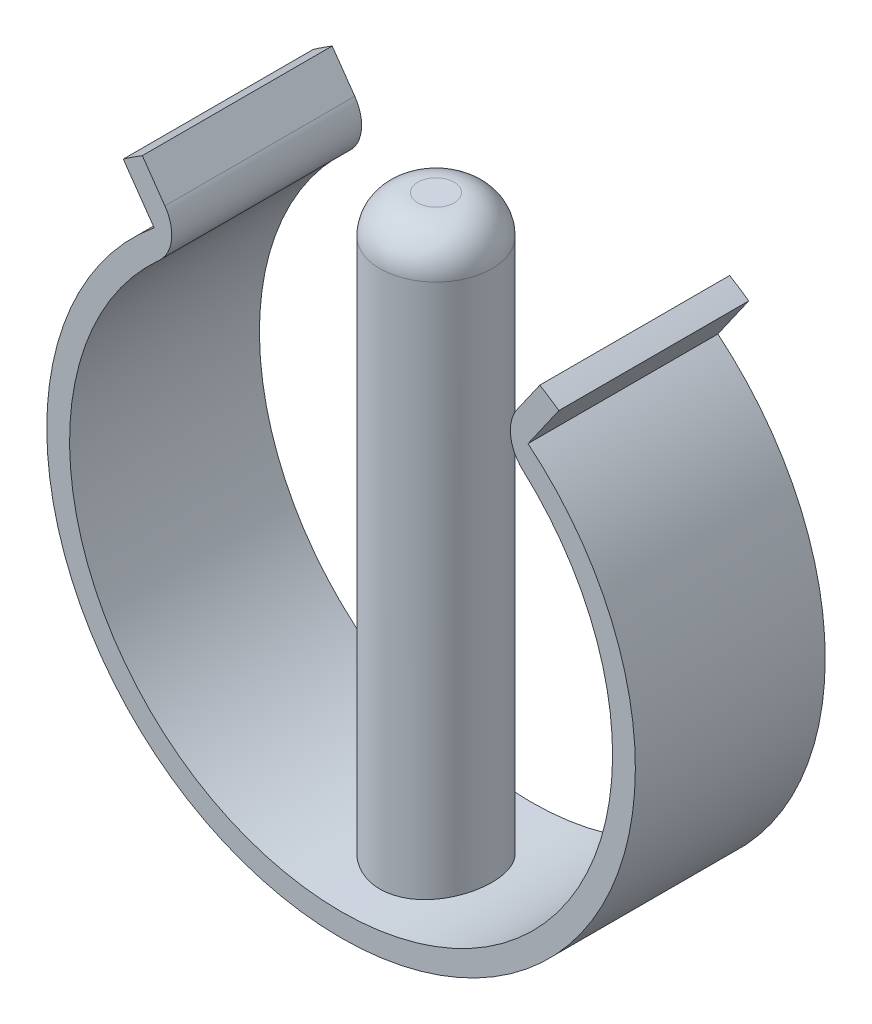
ISO-10303-21;
HEADER;
FILE_DESCRIPTION(('STEP AP214'),'2;1');
FILE_NAME('part.step','',(''),(''),'','','');
FILE_SCHEMA(('AUTOMOTIVE_DESIGN { 1 0 10303 214 1 1 1 1 }'));
ENDSEC;
DATA;
#1=APPLICATION_CONTEXT('core data for automotive mechanical design processes');
#2=APPLICATION_PROTOCOL_DEFINITION('international standard','automotive_design',2000,#1);
#3=PRODUCT_CONTEXT('',#1,'mechanical');
#4=PRODUCT('Part','Part','',(#3));
#5=PRODUCT_RELATED_PRODUCT_CATEGORY('part','',(#4));
#6=PRODUCT_DEFINITION_FORMATION('','',#4);
#7=PRODUCT_DEFINITION_CONTEXT('part definition',#1,'design');
#8=PRODUCT_DEFINITION('design','',#6,#7);
#9=PRODUCT_DEFINITION_SHAPE('','',#8);
#10=(LENGTH_UNIT() NAMED_UNIT(*) SI_UNIT(.MILLI.,.METRE.));
#11=(NAMED_UNIT(*) PLANE_ANGLE_UNIT() SI_UNIT($,.RADIAN.));
#12=(NAMED_UNIT(*) SI_UNIT($,.STERADIAN.) SOLID_ANGLE_UNIT());
#13=UNCERTAINTY_MEASURE_WITH_UNIT(LENGTH_MEASURE(1.E-05),#10,'distance_accuracy_value','');
#14=(GEOMETRIC_REPRESENTATION_CONTEXT(3) GLOBAL_UNCERTAINTY_ASSIGNED_CONTEXT((#13)) GLOBAL_UNIT_ASSIGNED_CONTEXT((#10,
#11,#12)) REPRESENTATION_CONTEXT('',''));
#15=CARTESIAN_POINT('',(0.,0.,0.));
#16=DIRECTION('',(0.,0.,1.));
#17=DIRECTION('',(1.,0.,0.));
#18=AXIS2_PLACEMENT_3D('',#15,#16,#17);
#19=CARTESIAN_POINT('',(0.,0.,-5.));
#20=DIRECTION('',(0.,0.,1.));
#21=DIRECTION('',(1.,0.,0.));
#22=AXIS2_PLACEMENT_3D('',#19,#20,#21);
#23=CYLINDRICAL_SURFACE('',#22,15.5);
#24=DIRECTION('',(0.,0.,1.));
#25=VECTOR('',#24,1.);
#26=CARTESIAN_POINT('',(9.84673362216088,11.9704568406643,-5.));
#27=LINE('',#26,#25);
#28=CARTESIAN_POINT('',(9.84673362216088,11.9704568406643,-5.));
#29=VERTEX_POINT('',#28);
#30=CARTESIAN_POINT('',(9.84673362216088,11.9704568406643,5.));
#31=VERTEX_POINT('',#30);
#32=EDGE_CURVE('E220',#29,#31,#27,.T.);
#33=ORIENTED_EDGE('',*,*,#32,.T.);
#34=CARTESIAN_POINT('',(0.,0.,5.));
#35=DIRECTION('',(0.,0.,1.));
#36=DIRECTION('',(1.,0.,0.));
#37=AXIS2_PLACEMENT_3D('',#34,#35,#36);
#38=CIRCLE('',#37,15.5);
#39=CARTESIAN_POINT('',(-9.84673362216089,11.9704568406643,5.));
#40=VERTEX_POINT('',#39);
#41=EDGE_CURVE('E298',#40,#31,#38,.T.);
#42=ORIENTED_EDGE('',*,*,#41,.F.);
#43=DIRECTION('',(0.,0.,1.));
#44=VECTOR('',#43,1.);
#45=CARTESIAN_POINT('',(-9.84673362216089,11.9704568406643,-5.));
#46=LINE('',#45,#44);
#47=CARTESIAN_POINT('',(-9.84673362216089,11.9704568406643,-5.));
#48=VERTEX_POINT('',#47);
#49=EDGE_CURVE('E216',#48,#40,#46,.T.);
#50=ORIENTED_EDGE('',*,*,#49,.F.);
#51=CARTESIAN_POINT('',(0.,0.,-5.));
#52=DIRECTION('',(0.,0.,1.));
#53=DIRECTION('',(1.,0.,0.));
#54=AXIS2_PLACEMENT_3D('',#51,#52,#53);
#55=CIRCLE('',#54,15.5);
#56=EDGE_CURVE('E296',#48,#29,#55,.T.);
#57=ORIENTED_EDGE('',*,*,#56,.T.);
#58=EDGE_LOOP('',(#33,#42,#50,#57));
#59=FACE_BOUND('',#58,.T.);
#60=CARTESIAN_POINT('',(-4.77223675564578,-14.7470592440684,1.65527062637535));
#61=CARTESIAN_POINT('',(-4.71636246479509,-14.7651434306736,1.73901117131563));
#62=CARTESIAN_POINT('',(-4.65690198422464,-14.7840314983771,1.82008646527447));
#63=CARTESIAN_POINT('',(-4.5316711499994,-14.8228954583229,1.97675558795974));
#64=CARTESIAN_POINT('',(-4.46590938134432,-14.8428698549168,2.05235663498693));
#65=CARTESIAN_POINT('',(-4.26119187841593,-14.9034346724191,2.27001731757343));
#66=CARTESIAN_POINT('',(-4.11399159584715,-14.9449363318782,2.4041187047719));
#67=CARTESIAN_POINT('',(-3.73592738668649,-15.0447856868346,2.70452618656024));
#68=CARTESIAN_POINT('',(-3.49631062950652,-15.1027012367679,2.85987488438209));
#69=CARTESIAN_POINT('',(-2.99312925519062,-15.210450570554,3.1313489943489));
#70=CARTESIAN_POINT('',(-2.72946179184354,-15.2602468400873,3.24729488063657));
#71=CARTESIAN_POINT('',(-2.28611144939952,-15.3314813210058,3.40672047791046));
#72=CARTESIAN_POINT('',(-2.1108443042756,-15.356640305997,3.46120982339265));
#73=CARTESIAN_POINT('',(-1.75574800628402,-15.401276786686,3.55602285113561));
#74=CARTESIAN_POINT('',(-1.5759177317838,-15.420752870511,3.59634301368035));
#75=CARTESIAN_POINT('',(-1.21332371881316,-15.4535103938055,3.66331540350875));
#76=CARTESIAN_POINT('',(-1.03056200056071,-15.4667959245349,3.6899766589571));
#77=CARTESIAN_POINT('',(-0.663159389704062,-15.4869002660163,3.73006952966727));
#78=CARTESIAN_POINT('',(-0.47851765447453,-15.4937160352894,3.74349492277431));
#79=CARTESIAN_POINT('',(-0.106921217796247,-15.5007554759639,3.75735880991027));
#80=CARTESIAN_POINT('',(0.0800391273800348,-15.5009178768654,3.75767659690342));
#81=CARTESIAN_POINT('',(0.453315892231561,-15.494493596953,3.74502807086891));
#82=CARTESIAN_POINT('',(0.639632554925448,-15.4879098279929,3.73206748919287));
#83=CARTESIAN_POINT('',(1.01063030618153,-15.4681337258967,3.69265817209845));
#84=CARTESIAN_POINT('',(1.19531003969522,-15.4549363589415,3.66619916232183));
#85=CARTESIAN_POINT('',(1.56155925139163,-15.4222343618315,3.59940099964486));
#86=CARTESIAN_POINT('',(1.74312938701404,-15.4027310826657,3.55906481969385));
#87=CARTESIAN_POINT('',(2.07283835609482,-15.3615213800739,3.47161447632755));
#88=CARTESIAN_POINT('',(2.22165354270744,-15.3406750741924,3.42663681205228));
#89=CARTESIAN_POINT('',(2.51508353930932,-15.2953057624268,3.32610914658735));
#90=CARTESIAN_POINT('',(2.65969921382182,-15.270783519779,3.2705613394372));
#91=CARTESIAN_POINT('',(2.94311217322447,-15.2186983518577,3.14863651328495));
#92=CARTESIAN_POINT('',(3.08192828067329,-15.1911465232026,3.08229861412333));
#93=CARTESIAN_POINT('',(3.35289491564658,-15.133646146656,2.93817752998317));
#94=CARTESIAN_POINT('',(3.48505038453811,-15.1036994194543,2.86040300252009));
#95=CARTESIAN_POINT('',(3.67249632208284,-15.0587686635973,2.73780743282703));
#96=CARTESIAN_POINT('',(3.73101929196821,-15.0443680451123,2.69766716734873));
#97=CARTESIAN_POINT('',(3.84618625318938,-15.0153384762655,2.61471658723914));
#98=CARTESIAN_POINT('',(3.90282786440912,-15.0007092687099,2.5719030740573));
#99=CARTESIAN_POINT('',(4.1239182767908,-14.9423052649877,2.39624598709964));
#100=CARTESIAN_POINT('',(4.28009367270594,-14.8980939651839,2.25276642564827));
#101=CARTESIAN_POINT('',(4.56696827236643,-14.812669991642,1.94150225240908));
#102=CARTESIAN_POINT('',(4.69771076460898,-14.7714522988834,1.77375980164158));
#103=CARTESIAN_POINT('',(4.86756006267002,-14.7159898051548,1.50700318945384));
#104=CARTESIAN_POINT('',(4.91937483563712,-14.6987168135106,1.41661672042463));
#105=CARTESIAN_POINT('',(5.01407942186206,-14.6666792592423,1.23073439204272));
#106=CARTESIAN_POINT('',(5.0569583985842,-14.6519177462503,1.13523250348432));
#107=CARTESIAN_POINT('',(5.09484763232555,-14.6387338114806,1.03744697777149));
#108=B_SPLINE_CURVE_WITH_KNOTS('',3,(#60,#61,#62,#63,#64,#65,#66,#67,#68,#69,#70,#71,#72,#73,
#74,#75,#76,#77,#78,#79,#80,#81,#82,#83,#84,#85,#86,#87,#88,#89,#90,#91,#92,#93,#94,#95,#96,#97,
#98,#99,#100,#101,#102,#103,#104,#105,#106,#107),.UNSPECIFIED.,.F.,.F.,(4,2,2,2,2,2,2,2,2,2,2,2,
2,2,2,2,2,2,2,2,2,2,2,4),(0.,0.306613586179854,0.612815219968257,1.22088489459189,
2.09049821300265,2.96402212092531,3.51916924688574,4.07445417763987,4.62937160514357,
5.18454977410793,5.7448394097782,6.30488730908343,6.86536212749915,7.42571694834263,
7.89586344055284,8.36591245092,8.83429378837111,9.3023223697217,9.51949195534505,
9.73692655839493,10.3842721224779,11.0305060308529,11.3468496170348,11.6635746322412),.UNSPECIFIED.);
#109=CARTESIAN_POINT('',(-3.95766012474572,-14.9862245524681,2.52833853146323));
#110=VERTEX_POINT('',#109);
#111=CARTESIAN_POINT('',(3.95766012474572,-14.9862245524681,2.52833853146323));
#112=VERTEX_POINT('',#111);
#113=EDGE_CURVE('E168',#110,#112,#108,.T.);
#114=ORIENTED_EDGE('',*,*,#113,.T.);
#115=DIRECTION('',(0.,0.,1.));
#116=VECTOR('',#115,1.);
#117=CARTESIAN_POINT('',(3.95766012474572,-14.9862245524681,-5.));
#118=LINE('',#117,#116);
#119=CARTESIAN_POINT('',(3.95766012474572,-14.9862245524681,-2.52833853146323));
#120=VERTEX_POINT('',#119);
#121=EDGE_CURVE('E11',#112,#120,#118,.F.);
#122=ORIENTED_EDGE('',*,*,#121,.T.);
#123=CARTESIAN_POINT('',(4.77223675564578,-14.7470592440684,-1.65527062637535));
#124=CARTESIAN_POINT('',(4.71636246479504,-14.7651434306736,-1.7390111713157));
#125=CARTESIAN_POINT('',(4.65690198422454,-14.7840314983772,-1.82008646527462));
#126=CARTESIAN_POINT('',(4.53167114999917,-14.822895458323,-1.97675558796002));
#127=CARTESIAN_POINT('',(4.46590938134402,-14.8428698549169,-2.05235663498726));
#128=CARTESIAN_POINT('',(4.26119187841543,-14.9034346724192,-2.27001731757392));
#129=CARTESIAN_POINT('',(4.11399159584649,-14.9449363318784,-2.40411870477248));
#130=CARTESIAN_POINT('',(3.73592738668559,-15.0447856868348,-2.70452618656087));
#131=CARTESIAN_POINT('',(3.49631062950554,-15.1027012367681,-2.85987488438269));
#132=CARTESIAN_POINT('',(2.99312925518948,-15.2104505705543,-3.13134899434944));
#133=CARTESIAN_POINT('',(2.72946179184233,-15.2602468400875,-3.24729488063708));
#134=CARTESIAN_POINT('',(2.2861114493982,-15.331481321006,-3.40672047791089));
#135=CARTESIAN_POINT('',(2.11084430427425,-15.3566403059972,-3.46120982339305));
#136=CARTESIAN_POINT('',(1.7557480062826,-15.4012767866862,-3.55602285113595));
#137=CARTESIAN_POINT('',(1.57591773178235,-15.4207528705111,-3.59634301368066));
#138=CARTESIAN_POINT('',(1.21332371881166,-15.4535103938057,-3.66331540350899));
#139=CARTESIAN_POINT('',(1.03056200055918,-15.466795924535,-3.6899766589573));
#140=CARTESIAN_POINT('',(0.663159389702477,-15.4869002660164,-3.73006952966741));
#141=CARTESIAN_POINT('',(0.478517654472921,-15.4937160352895,-3.74349492277441));
#142=CARTESIAN_POINT('',(0.106921217794594,-15.5007554759639,-3.75735880991029));
#143=CARTESIAN_POINT('',(-0.0800391273817059,-15.5009178768654,-3.7576765969034));
#144=CARTESIAN_POINT('',(-0.453315892233266,-15.4944935969529,-3.74502807086881));
#145=CARTESIAN_POINT('',(-0.639632554927168,-15.4879098279929,-3.73206748919273));
#146=CARTESIAN_POINT('',(-1.01063030618327,-15.4681337258966,-3.69265817209823));
#147=CARTESIAN_POINT('',(-1.19531003969698,-15.4549363589414,-3.66619916232156));
#148=CARTESIAN_POINT('',(-1.5615592513934,-15.4222343618313,-3.59940099964449));
#149=CARTESIAN_POINT('',(-1.74312938701582,-15.4027310826655,-3.55906481969344));
#150=CARTESIAN_POINT('',(-2.07283835609658,-15.3615213800737,-3.47161447632704));
#151=CARTESIAN_POINT('',(-2.22165354270918,-15.3406750741921,-3.42663681205173));
#152=CARTESIAN_POINT('',(-2.51508353931103,-15.2953057624265,-3.32610914658672));
#153=CARTESIAN_POINT('',(-2.65969921382351,-15.2707835197787,-3.27056133943653));
#154=CARTESIAN_POINT('',(-2.94311217322611,-15.2186983518574,-3.14863651328419));
#155=CARTESIAN_POINT('',(-3.08192828067491,-15.1911465232023,-3.08229861412253));
#156=CARTESIAN_POINT('',(-3.35289491564813,-15.1336461466556,-2.93817752998229));
#157=CARTESIAN_POINT('',(-3.48505038453963,-15.1036994194539,-2.86040300251916));
#158=CARTESIAN_POINT('',(-3.67249632208392,-15.058768663597,-2.7378074328263));
#159=CARTESIAN_POINT('',(-3.7310192919689,-15.0443680451122,-2.69766716734825));
#160=CARTESIAN_POINT('',(-3.8461862531893,-15.0153384762655,-2.6147165872392));
#161=CARTESIAN_POINT('',(-3.90282786440866,-15.00070926871,-2.57190307405765));
#162=CARTESIAN_POINT('',(-4.12391827678999,-14.942305264988,-2.39624598710035));
#163=CARTESIAN_POINT('',(-4.28009367270515,-14.8980939651841,-2.25276642564903));
#164=CARTESIAN_POINT('',(-4.5669682723657,-14.8126699916422,-1.94150225240995));
#165=CARTESIAN_POINT('',(-4.69771076460829,-14.7714522988836,-1.77375980164251));
#166=CARTESIAN_POINT('',(-4.86756006266953,-14.715989805155,-1.50700318945469));
#167=CARTESIAN_POINT('',(-4.91937483563675,-14.6987168135107,-1.41661672042533));
#168=CARTESIAN_POINT('',(-5.0140794218619,-14.6666792592423,-1.23073439204308));
#169=CARTESIAN_POINT('',(-5.05695839858413,-14.6519177462503,-1.1352325034845));
#170=CARTESIAN_POINT('',(-5.09484763232555,-14.6387338114806,-1.03744697777149));
#171=B_SPLINE_CURVE_WITH_KNOTS('',3,(#123,#124,#125,#126,#127,#128,#129,#130,#131,#132,#133,
#134,#135,#136,#137,#138,#139,#140,#141,#142,#143,#144,#145,#146,#147,#148,#149,#150,#151,#152,
#153,#154,#155,#156,#157,#158,#159,#160,#161,#162,#163,#164,#165,#166,#167,#168,#169,#170),
.UNSPECIFIED.,.F.,.F.,(4,2,2,2,2,2,2,2,2,2,2,2,2,2,2,2,2,2,2,2,2,2,2,4),(0.,0.306613586180124,
0.612815219968796,1.22088489459296,2.09049821300387,2.96402212092669,3.51916924688719,
4.07445417764137,4.62937160514514,5.18454977410956,5.74483940977988,6.30488730908517,
6.86536212750095,7.42571694834448,7.89586344055468,8.36591245092183,8.83429378837293,
9.30232236972351,9.51949195534542,9.73692655839385,10.3842721224768,11.0305060308517,
11.3468496170342,11.6635746322412),.UNSPECIFIED.);
#172=CARTESIAN_POINT('',(-3.95766012474572,-14.9862245524681,-2.52833853146323));
#173=VERTEX_POINT('',#172);
#174=EDGE_CURVE('E52',#120,#173,#171,.T.);
#175=ORIENTED_EDGE('',*,*,#174,.T.);
#176=DIRECTION('',(0.,0.,1.));
#177=VECTOR('',#176,1.);
#178=CARTESIAN_POINT('',(-3.95766012474572,-14.9862245524681,-5.));
#179=LINE('',#178,#177);
#180=EDGE_CURVE('E181',#173,#110,#179,.T.);
#181=ORIENTED_EDGE('',*,*,#180,.T.);
#182=EDGE_LOOP('',(#114,#122,#175,#181));
#183=FACE_BOUND('',#182,.T.);
#184=ADVANCED_FACE('F44',(#59,#183),#23,.T.);
#185=CARTESIAN_POINT('',(-9.84673362216089,11.9704568406643,-5.));
#186=DIRECTION('',(-0.819152044288991,-0.573576436351047,0.));
#187=DIRECTION('',(0.573576436351047,-0.819152044288991,0.));
#188=AXIS2_PLACEMENT_3D('',#185,#186,#187);
#189=PLANE('',#188);
#190=ORIENTED_EDGE('',*,*,#49,.T.);
#191=DIRECTION('',(0.573576436351047,-0.819152044288991,0.));
#192=VECTOR('',#191,1.);
#193=CARTESIAN_POINT('',(-9.84673362216089,11.9704568406643,5.));
#194=LINE('',#193,#192);
#195=CARTESIAN_POINT('',(-11.4715287270209,14.2909047310345,5.));
#196=VERTEX_POINT('',#195);
#197=EDGE_CURVE('E306',#196,#40,#194,.T.);
#198=ORIENTED_EDGE('',*,*,#197,.F.);
#199=DIRECTION('',(0.,0.,1.));
#200=VECTOR('',#199,1.);
#201=CARTESIAN_POINT('',(-11.4715287270209,14.2909047310345,-5.));
#202=LINE('',#201,#200);
#203=CARTESIAN_POINT('',(-11.4715287270209,14.2909047310345,-5.));
#204=VERTEX_POINT('',#203);
#205=EDGE_CURVE('E284',#204,#196,#202,.T.);
#206=ORIENTED_EDGE('',*,*,#205,.F.);
#207=DIRECTION('',(0.573576436351047,-0.819152044288991,0.));
#208=VECTOR('',#207,1.);
#209=CARTESIAN_POINT('',(-9.84673362216089,11.9704568406643,-5.));
#210=LINE('',#209,#208);
#211=EDGE_CURVE('E278',#204,#48,#210,.T.);
#212=ORIENTED_EDGE('',*,*,#211,.T.);
#213=EDGE_LOOP('',(#190,#198,#206,#212));
#214=FACE_BOUND('',#213,.T.);
#215=ADVANCED_FACE('F151',(#214),#189,.T.);
#216=CARTESIAN_POINT('',(0.,-2.09213615474531,-5.));
#217=DIRECTION('',(0.,0.,1.));
#218=DIRECTION('',(1.,0.,0.));
#219=AXIS2_PLACEMENT_3D('',#216,#217,#218);
#220=CYLINDRICAL_SURFACE('',#219,20.);
#221=ORIENTED_EDGE('',*,*,#205,.T.);
#222=CARTESIAN_POINT('',(0.,-2.09213615474531,5.));
#223=DIRECTION('',(0.,0.,1.));
#224=DIRECTION('',(1.,0.,0.));
#225=AXIS2_PLACEMENT_3D('',#222,#223,#224);
#226=CIRCLE('',#225,20.);
#227=CARTESIAN_POINT('',(-10.4678789047625,14.9496803926544,5.));
#228=VERTEX_POINT('',#227);
#229=EDGE_CURVE('E251',#228,#196,#226,.T.);
#230=ORIENTED_EDGE('',*,*,#229,.F.);
#231=DIRECTION('',(0.,0.,1.));
#232=VECTOR('',#231,1.);
#233=CARTESIAN_POINT('',(-10.4678789047625,14.9496803926544,-5.));
#234=LINE('',#233,#232);
#235=CARTESIAN_POINT('',(-10.4678789047625,14.9496803926544,-5.));
#236=VERTEX_POINT('',#235);
#237=EDGE_CURVE('E246',#236,#228,#234,.T.);
#238=ORIENTED_EDGE('',*,*,#237,.F.);
#239=CARTESIAN_POINT('',(0.,-2.09213615474531,-5.));
#240=DIRECTION('',(0.,0.,1.));
#241=DIRECTION('',(1.,0.,0.));
#242=AXIS2_PLACEMENT_3D('',#239,#240,#241);
#243=CIRCLE('',#242,20.);
#244=EDGE_CURVE('E271',#236,#204,#243,.T.);
#245=ORIENTED_EDGE('',*,*,#244,.T.);
#246=EDGE_LOOP('',(#221,#230,#238,#245));
#247=FACE_BOUND('',#246,.T.);
#248=ADVANCED_FACE('F158',(#247),#220,.T.);
#249=CARTESIAN_POINT('',(-8.20214303981997,11.7138742333326,-5.));
#250=DIRECTION('',(0.819152044288992,0.573576436351047,0.));
#251=DIRECTION('',(-0.573576436351047,0.819152044288992,0.));
#252=AXIS2_PLACEMENT_3D('',#249,#250,#251);
#253=PLANE('',#252);
#254=DIRECTION('',(-0.573576436351047,0.819152044288992,0.));
#255=VECTOR('',#254,1.);
#256=CARTESIAN_POINT('',(-8.20214303981997,11.7138742333326,5.));
#257=LINE('',#256,#255);
#258=CARTESIAN_POINT('',(-9.27865153707979,13.2512876979351,5.));
#259=VERTEX_POINT('',#258);
#260=EDGE_CURVE('E248',#259,#228,#257,.T.);
#261=ORIENTED_EDGE('',*,*,#260,.F.);
#262=DIRECTION('',(0.,0.,1.));
#263=VECTOR('',#262,1.);
#264=CARTESIAN_POINT('',(-9.27865153707979,13.2512876979351,-5.));
#265=LINE('',#264,#263);
#266=CARTESIAN_POINT('',(-9.27865153707979,13.2512876979351,-5.));
#267=VERTEX_POINT('',#266);
#268=EDGE_CURVE('E70',#259,#267,#265,.F.);
#269=ORIENTED_EDGE('',*,*,#268,.T.);
#270=DIRECTION('',(-0.573576436351047,0.819152044288992,0.));
#271=VECTOR('',#270,1.);
#272=CARTESIAN_POINT('',(-8.20214303981997,11.7138742333326,-5.));
#273=LINE('',#272,#271);
#274=EDGE_CURVE('E262',#267,#236,#273,.T.);
#275=ORIENTED_EDGE('',*,*,#274,.T.);
#276=ORIENTED_EDGE('',*,*,#237,.T.);
#277=EDGE_LOOP('',(#261,#269,#275,#276));
#278=FACE_BOUND('',#277,.T.);
#279=ADVANCED_FACE('F236',(#278),#253,.T.);
#280=CARTESIAN_POINT('',(0.,0.,-5.));
#281=DIRECTION('',(0.,0.,1.));
#282=DIRECTION('',(1.,0.,0.));
#283=AXIS2_PLACEMENT_3D('',#280,#281,#282);
#284=CYLINDRICAL_SURFACE('',#283,14.3);
#285=CARTESIAN_POINT('',(0.,-14.3,2.95));
#286=CARTESIAN_POINT('',(0.163841722585895,-14.2999969689063,2.94999410618232));
#287=CARTESIAN_POINT('',(0.327756852052322,-14.2971553770271,2.93630434325404));
#288=CARTESIAN_POINT('',(0.650946464242781,-14.2860939118933,2.88195483539313));
#289=CARTESIAN_POINT('',(0.810217283059614,-14.2778699062695,2.84127436791077));
#290=CARTESIAN_POINT('',(1.11939943023506,-14.2569610787371,2.73425963110293));
#291=CARTESIAN_POINT('',(1.26931982152059,-14.2442806578988,2.66795066556831));
#292=CARTESIAN_POINT('',(1.55589879521797,-14.2158342358559,2.5116380987011));
#293=CARTESIAN_POINT('',(1.69255801966879,-14.200068384144,2.42163564527207));
#294=CARTESIAN_POINT('',(1.95070702564178,-14.1669304560571,2.21912120765758));
#295=CARTESIAN_POINT('',(2.07197893900383,-14.1495403188735,2.10633443178883));
#296=CARTESIAN_POINT('',(2.29402349554296,-14.1152438260655,1.86204341589715));
#297=CARTESIAN_POINT('',(2.39479446632009,-14.0983375100062,1.73053765032631));
#298=CARTESIAN_POINT('',(2.57391504247141,-14.0667459652516,1.45096015676774));
#299=CARTESIAN_POINT('',(2.65203698002839,-14.052083944923,1.30273971058118));
#300=CARTESIAN_POINT('',(2.78218277574213,-14.0268985096164,0.994923373425597));
#301=CARTESIAN_POINT('',(2.83420938734308,-14.0163746580254,0.835328684638343));
#302=CARTESIAN_POINT('',(2.90997621460727,-14.0008402578745,0.511644665388665));
#303=CARTESIAN_POINT('',(2.93409984143762,-13.9957550528001,0.347648739702264));
#304=CARTESIAN_POINT('',(2.95456724507244,-13.9914491670343,0.0178645234595335));
#305=CARTESIAN_POINT('',(2.95091404842858,-13.9922278474164,-0.147923569857294));
#306=CARTESIAN_POINT('',(2.91624102463609,-13.9994939987608,-0.473766238838097));
#307=CARTESIAN_POINT('',(2.88566262602374,-14.00588938163,-0.633870148459475));
#308=CARTESIAN_POINT('',(2.79870482621837,-14.023523147272,-0.946625554892515));
#309=CARTESIAN_POINT('',(2.74232412204377,-14.0347617746205,-1.09927667491749));
#310=CARTESIAN_POINT('',(2.60494596507215,-14.0609087548611,-1.39405523232551));
#311=CARTESIAN_POINT('',(2.52377526144843,-14.0758427899293,-1.53609955561466));
#312=CARTESIAN_POINT('',(2.33924334392237,-14.1076816534559,-1.80471621983175));
#313=CARTESIAN_POINT('',(2.23587942387343,-14.1245867221387,-1.93128667098498));
#314=CARTESIAN_POINT('',(2.00754046258069,-14.1588605802512,-2.16790803885592));
#315=CARTESIAN_POINT('',(1.88218911356411,-14.1762320467022,-2.27759575357075));
#316=CARTESIAN_POINT('',(1.61467954856982,-14.2091851523889,-2.47444691877491));
#317=CARTESIAN_POINT('',(1.47252108983696,-14.2247667657662,-2.56161004387017));
#318=CARTESIAN_POINT('',(1.17501621750201,-14.2524266734776,-2.7110122897235));
#319=CARTESIAN_POINT('',(1.01964735410506,-14.2644988435957,-2.77320791166588));
#320=CARTESIAN_POINT('',(0.700360929181165,-14.2837335275631,-2.87051174008844));
#321=CARTESIAN_POINT('',(0.536444473646947,-14.2908966749145,-2.90562344178077));
#322=CARTESIAN_POINT('',(0.207835107836974,-14.2994173593822,-2.94724394280993));
#323=CARTESIAN_POINT('',(0.0432076490059885,-14.3008757106555,-2.95424948681123));
#324=CARTESIAN_POINT('',(-0.284865316871062,-14.2981033195818,-2.94079941645631));
#325=CARTESIAN_POINT('',(-0.448310894220794,-14.2938729184734,-2.92034544925333));
#326=CARTESIAN_POINT('',(-0.767763781400714,-14.2802616155787,-2.85296943638778));
#327=CARTESIAN_POINT('',(-0.923827556158175,-14.2709306954868,-2.80630412411673));
#328=CARTESIAN_POINT('',(-1.22591446176273,-14.2481613178345,-2.68811206482189));
#329=CARTESIAN_POINT('',(-1.37193680417203,-14.2347225381815,-2.61658336822724));
#330=CARTESIAN_POINT('',(-1.65187745398911,-14.2049777273266,-2.44963333948717));
#331=CARTESIAN_POINT('',(-1.78561503688547,-14.1886369000144,-2.35391530256555));
#332=CARTESIAN_POINT('',(-2.03530814621494,-14.1549787134301,-2.14169878565228));
#333=CARTESIAN_POINT('',(-2.15126163244709,-14.1376612424282,-2.02519792475539));
#334=CARTESIAN_POINT('',(-2.36402761888505,-14.1036589622715,-1.77245528847141));
#335=CARTESIAN_POINT('',(-2.4604980979203,-14.0869890256166,-1.63592323524805));
#336=CARTESIAN_POINT('',(-2.62913869578987,-14.0564932985215,-1.34830150636503));
#337=CARTESIAN_POINT('',(-2.70130981727809,-14.0426673907385,-1.19721243169641));
#338=CARTESIAN_POINT('',(-2.81884571742645,-14.019547110455,-0.885546251577705));
#339=CARTESIAN_POINT('',(-2.86435386121394,-14.0102285503772,-0.72502509303193));
#340=CARTESIAN_POINT('',(-2.92770237856451,-13.9971291364917,-0.398400257235403));
#341=CARTESIAN_POINT('',(-2.94554662240045,-13.9933475080526,-0.232297364210779));
#342=CARTESIAN_POINT('',(-2.95291046268694,-13.9917950538885,0.0973373752831337));
#343=CARTESIAN_POINT('',(-2.94297107506707,-13.9939094167003,0.26085683250768));
#344=CARTESIAN_POINT('',(-2.89624887764608,-14.003653163164,0.583838582339898));
#345=CARTESIAN_POINT('',(-2.85946631480969,-14.0112824960766,0.743300912260311));
#346=CARTESIAN_POINT('',(-2.76034990588863,-14.0311436791289,1.05326965895898));
#347=CARTESIAN_POINT('',(-2.69808646452774,-14.0433628398025,1.20379945480688));
#348=CARTESIAN_POINT('',(-2.5498395371863,-14.0710333426979,1.49235942064603));
#349=CARTESIAN_POINT('',(-2.46385390158294,-14.0864849778045,1.6303884563555));
#350=CARTESIAN_POINT('',(-2.26877301256592,-14.1192280010037,1.89271401461865));
#351=CARTESIAN_POINT('',(-2.15928870439967,-14.1365475586425,2.01671775077876));
#352=CARTESIAN_POINT('',(-1.92111687720311,-14.1708770906661,2.24477145965752));
#353=CARTESIAN_POINT('',(-1.79242494558888,-14.1878869929033,2.3488168347403));
#354=CARTESIAN_POINT('',(-1.5177470436796,-14.219907067095,2.53511241622957));
#355=CARTESIAN_POINT('',(-1.3715825996425,-14.234892555608,2.61710391775635));
#356=CARTESIAN_POINT('',(-1.0672773894053,-14.2609310352515,2.75522909720223));
#357=CARTESIAN_POINT('',(-0.909147318728869,-14.2719874891583,2.81138555724615));
#358=CARTESIAN_POINT('',(-0.625603302194258,-14.2868309766549,2.8856519592589));
#359=CARTESIAN_POINT('',(-0.501778584688962,-14.2917399154246,2.90973848346855));
#360=CARTESIAN_POINT('',(-0.25198366811124,-14.2983255351244,2.94191448525299));
#361=CARTESIAN_POINT('',(-0.126013545675438,-14.3000023312674,2.95000453303867));
#362=CARTESIAN_POINT('',(0.,-14.3,2.95));
#363=B_SPLINE_CURVE_WITH_KNOTS('',3,(#285,#286,#287,#288,#289,#290,#291,#292,#293,#294,#295,
#296,#297,#298,#299,#300,#301,#302,#303,#304,#305,#306,#307,#308,#309,#310,#311,#312,#313,#314,
#315,#316,#317,#318,#319,#320,#321,#322,#323,#324,#325,#326,#327,#328,#329,#330,#331,#332,#333,
#334,#335,#336,#337,#338,#339,#340,#341,#342,#343,#344,#345,#346,#347,#348,#349,#350,#351,#352,
#353,#354,#355,#356,#357,#358,#359,#360,#361,#362),.UNSPECIFIED.,.T.,.F.,(4,2,2,2,2,2,2,2,2,2,2,
2,2,2,2,2,2,2,2,2,2,2,2,2,2,2,2,2,2,2,2,2,2,2,2,2,2,2,4),(0.,0.49106408743202,0.98250563421376,
1.47346320031529,1.96439698485018,2.46164912973438,2.95894182257366,3.46107251355041,
3.96315021113532,4.45824374736085,4.95328333916414,5.44035497584291,5.92745121169622,
6.41803271001606,6.90867406176783,7.40872122154536,7.90877560468604,8.40969744912306,
8.91055463817964,9.40251968005115,9.89445521281739,10.3816543411501,10.8688916800316,
11.3624230633685,11.8560110226043,12.3576275672362,12.8592234113437,13.3580968497714,
13.856900487823,14.3460592195676,14.8352134509714,15.3230251573641,15.8108810820859,
16.3075413549601,16.8043159021502,17.3066861808603,17.8086126010113,18.186312076793,
18.563998088845),.UNSPECIFIED.);
#364=CARTESIAN_POINT('',(0.,-14.3,2.95));
#365=VERTEX_POINT('',#364);
#366=EDGE_CURVE('E208',#365,#365,#363,.T.);
#367=ORIENTED_EDGE('',*,*,#366,.F.);
#368=EDGE_LOOP('',(#367));
#369=FACE_BOUND('',#368,.T.);
#370=CARTESIAN_POINT('',(0.,0.,5.));
#371=DIRECTION('',(0.,0.,-1.));
#372=DIRECTION('',(1.,0.,0.));
#373=AXIS2_PLACEMENT_3D('',#370,#371,#372);
#374=CIRCLE('',#373,14.3);
#375=CARTESIAN_POINT('',(9.57745186790835,10.6189649080265,5.));
#376=VERTEX_POINT('',#375);
#377=CARTESIAN_POINT('',(-9.57745186790835,10.6189649080265,5.));
#378=VERTEX_POINT('',#377);
#379=EDGE_CURVE('E255',#376,#378,#374,.T.);
#380=ORIENTED_EDGE('',*,*,#379,.F.);
#381=DIRECTION('',(0.,0.,1.));
#382=VECTOR('',#381,1.);
#383=CARTESIAN_POINT('',(9.57745186790835,10.6189649080265,-5.));
#384=LINE('',#383,#382);
#385=CARTESIAN_POINT('',(9.57745186790835,10.6189649080265,-5.));
#386=VERTEX_POINT('',#385);
#387=EDGE_CURVE('E187',#376,#386,#384,.F.);
#388=ORIENTED_EDGE('',*,*,#387,.T.);
#389=CARTESIAN_POINT('',(0.,0.,-5.));
#390=DIRECTION('',(0.,0.,-1.));
#391=DIRECTION('',(1.,0.,0.));
#392=AXIS2_PLACEMENT_3D('',#389,#390,#391);
#393=CIRCLE('',#392,14.3);
#394=CARTESIAN_POINT('',(-9.57745186790835,10.6189649080265,-5.));
#395=VERTEX_POINT('',#394);
#396=EDGE_CURVE('E261',#386,#395,#393,.T.);
#397=ORIENTED_EDGE('',*,*,#396,.T.);
#398=DIRECTION('',(0.,0.,1.));
#399=VECTOR('',#398,1.);
#400=CARTESIAN_POINT('',(-9.57745186790835,10.6189649080265,-5.));
#401=LINE('',#400,#399);
#402=EDGE_CURVE('E195',#395,#378,#401,.T.);
#403=ORIENTED_EDGE('',*,*,#402,.T.);
#404=EDGE_LOOP('',(#380,#388,#397,#403));
#405=FACE_BOUND('',#404,.T.);
#406=ADVANCED_FACE('F218',(#369,#405),#284,.F.);
#407=CARTESIAN_POINT('',(8.20214303981997,11.7138742333326,-5.));
#408=DIRECTION('',(-0.819152044288991,0.573576436351047,0.));
#409=DIRECTION('',(-0.573576436351047,-0.819152044288991,0.));
#410=AXIS2_PLACEMENT_3D('',#407,#408,#409);
#411=PLANE('',#410);
#412=DIRECTION('',(-0.573576436351047,-0.819152044288991,0.));
#413=VECTOR('',#412,1.);
#414=CARTESIAN_POINT('',(8.20214303981997,11.7138742333326,-5.));
#415=LINE('',#414,#413);
#416=CARTESIAN_POINT('',(10.4678789047625,14.9496803926544,-5.));
#417=VERTEX_POINT('',#416);
#418=CARTESIAN_POINT('',(9.27865153707979,13.2512876979351,-5.));
#419=VERTEX_POINT('',#418);
#420=EDGE_CURVE('E267',#417,#419,#415,.T.);
#421=ORIENTED_EDGE('',*,*,#420,.T.);
#422=DIRECTION('',(0.,0.,1.));
#423=VECTOR('',#422,1.);
#424=CARTESIAN_POINT('',(9.27865153707979,13.2512876979351,-5.));
#425=LINE('',#424,#423);
#426=CARTESIAN_POINT('',(9.27865153707979,13.2512876979351,5.));
#427=VERTEX_POINT('',#426);
#428=EDGE_CURVE('E200',#419,#427,#425,.T.);
#429=ORIENTED_EDGE('',*,*,#428,.T.);
#430=DIRECTION('',(-0.573576436351047,-0.819152044288991,0.));
#431=VECTOR('',#430,1.);
#432=CARTESIAN_POINT('',(8.20214303981997,11.7138742333326,5.));
#433=LINE('',#432,#431);
#434=CARTESIAN_POINT('',(10.4678789047625,14.9496803926544,5.));
#435=VERTEX_POINT('',#434);
#436=EDGE_CURVE('E312',#435,#427,#433,.T.);
#437=ORIENTED_EDGE('',*,*,#436,.F.);
#438=DIRECTION('',(0.,0.,1.));
#439=VECTOR('',#438,1.);
#440=CARTESIAN_POINT('',(10.4678789047625,14.9496803926544,-5.));
#441=LINE('',#440,#439);
#442=EDGE_CURVE('E290',#417,#435,#441,.T.);
#443=ORIENTED_EDGE('',*,*,#442,.F.);
#444=EDGE_LOOP('',(#421,#429,#437,#443));
#445=FACE_BOUND('',#444,.T.);
#446=ADVANCED_FACE('F242',(#445),#411,.T.);
#447=CARTESIAN_POINT('',(0.,-2.09213615474531,-5.));
#448=DIRECTION('',(0.,0.,1.));
#449=DIRECTION('',(1.,0.,0.));
#450=AXIS2_PLACEMENT_3D('',#447,#448,#449);
#451=CYLINDRICAL_SURFACE('',#450,20.);
#452=ORIENTED_EDGE('',*,*,#442,.T.);
#453=CARTESIAN_POINT('',(0.,-2.09213615474531,5.));
#454=DIRECTION('',(0.,0.,1.));
#455=DIRECTION('',(1.,0.,0.));
#456=AXIS2_PLACEMENT_3D('',#453,#454,#455);
#457=CIRCLE('',#456,20.);
#458=CARTESIAN_POINT('',(11.4715287270209,14.2909047310345,5.));
#459=VERTEX_POINT('',#458);
#460=EDGE_CURVE('E303',#459,#435,#457,.T.);
#461=ORIENTED_EDGE('',*,*,#460,.F.);
#462=DIRECTION('',(0.,0.,1.));
#463=VECTOR('',#462,1.);
#464=CARTESIAN_POINT('',(11.4715287270209,14.2909047310345,-5.));
#465=LINE('',#464,#463);
#466=CARTESIAN_POINT('',(11.4715287270209,14.2909047310345,-5.));
#467=VERTEX_POINT('',#466);
#468=EDGE_CURVE('E288',#467,#459,#465,.T.);
#469=ORIENTED_EDGE('',*,*,#468,.F.);
#470=CARTESIAN_POINT('',(0.,-2.09213615474531,-5.));
#471=DIRECTION('',(0.,0.,1.));
#472=DIRECTION('',(1.,0.,0.));
#473=AXIS2_PLACEMENT_3D('',#470,#471,#472);
#474=CIRCLE('',#473,20.);
#475=EDGE_CURVE('E273',#467,#417,#474,.T.);
#476=ORIENTED_EDGE('',*,*,#475,.T.);
#477=EDGE_LOOP('',(#452,#461,#469,#476));
#478=FACE_BOUND('',#477,.T.);
#479=ADVANCED_FACE('F324',(#478),#451,.T.);
#480=CARTESIAN_POINT('',(9.84673362216088,11.9704568406643,-5.));
#481=DIRECTION('',(0.81915204428899,-0.573576436351049,0.));
#482=DIRECTION('',(0.573576436351049,0.81915204428899,0.));
#483=AXIS2_PLACEMENT_3D('',#480,#481,#482);
#484=PLANE('',#483);
#485=ORIENTED_EDGE('',*,*,#468,.T.);
#486=DIRECTION('',(0.573576436351049,0.81915204428899,0.));
#487=VECTOR('',#486,1.);
#488=CARTESIAN_POINT('',(9.84673362216088,11.9704568406643,5.));
#489=LINE('',#488,#487);
#490=EDGE_CURVE('E297',#31,#459,#489,.T.);
#491=ORIENTED_EDGE('',*,*,#490,.F.);
#492=ORIENTED_EDGE('',*,*,#32,.F.);
#493=DIRECTION('',(0.573576436351049,0.81915204428899,0.));
#494=VECTOR('',#493,1.);
#495=CARTESIAN_POINT('',(9.84673362216088,11.9704568406643,-5.));
#496=LINE('',#495,#494);
#497=EDGE_CURVE('E321',#29,#467,#496,.T.);
#498=ORIENTED_EDGE('',*,*,#497,.T.);
#499=EDGE_LOOP('',(#485,#491,#492,#498));
#500=FACE_BOUND('',#499,.T.);
#501=ADVANCED_FACE('F164',(#500),#484,.T.);
#502=CARTESIAN_POINT('',(0.,0.,-5.));
#503=DIRECTION('',(0.,0.,1.));
#504=DIRECTION('',(1.,0.,0.));
#505=AXIS2_PLACEMENT_3D('',#502,#503,#504);
#506=PLANE('',#505);
#507=ORIENTED_EDGE('',*,*,#396,.F.);
#508=CARTESIAN_POINT('',(10.9169556256578,12.104134825233,-5.));
#509=DIRECTION('',(0.,0.,1.));
#510=DIRECTION('',(1.,0.,0.));
#511=AXIS2_PLACEMENT_3D('',#508,#509,#510);
#512=CIRCLE('',#511,2.);
#513=EDGE_CURVE('E184',#386,#419,#512,.F.);
#514=ORIENTED_EDGE('',*,*,#513,.T.);
#515=ORIENTED_EDGE('',*,*,#420,.F.);
#516=ORIENTED_EDGE('',*,*,#475,.F.);
#517=ORIENTED_EDGE('',*,*,#497,.F.);
#518=ORIENTED_EDGE('',*,*,#56,.F.);
#519=ORIENTED_EDGE('',*,*,#211,.F.);
#520=ORIENTED_EDGE('',*,*,#244,.F.);
#521=ORIENTED_EDGE('',*,*,#274,.F.);
#522=CARTESIAN_POINT('',(-10.9169556256578,12.104134825233,-5.));
#523=DIRECTION('',(0.,0.,1.));
#524=DIRECTION('',(1.,0.,0.));
#525=AXIS2_PLACEMENT_3D('',#522,#523,#524);
#526=CIRCLE('',#525,2.);
#527=EDGE_CURVE('E186',#267,#395,#526,.F.);
#528=ORIENTED_EDGE('',*,*,#527,.T.);
#529=EDGE_LOOP('',(#507,#514,#515,#516,#517,#518,#519,#520,#521,#528));
#530=FACE_BOUND('',#529,.T.);
#531=ADVANCED_FACE('F235',(#530),#506,.F.);
#532=CARTESIAN_POINT('',(0.,0.,5.));
#533=DIRECTION('',(0.,0.,1.));
#534=DIRECTION('',(1.,0.,0.));
#535=AXIS2_PLACEMENT_3D('',#532,#533,#534);
#536=PLANE('',#535);
#537=ORIENTED_EDGE('',*,*,#436,.T.);
#538=CARTESIAN_POINT('',(10.9169556256578,12.104134825233,5.));
#539=DIRECTION('',(0.,0.,1.));
#540=DIRECTION('',(1.,0.,0.));
#541=AXIS2_PLACEMENT_3D('',#538,#539,#540);
#542=CIRCLE('',#541,2.);
#543=EDGE_CURVE('E191',#427,#376,#542,.T.);
#544=ORIENTED_EDGE('',*,*,#543,.T.);
#545=ORIENTED_EDGE('',*,*,#379,.T.);
#546=CARTESIAN_POINT('',(-10.9169556256578,12.104134825233,5.));
#547=DIRECTION('',(0.,0.,1.));
#548=DIRECTION('',(1.,0.,0.));
#549=AXIS2_PLACEMENT_3D('',#546,#547,#548);
#550=CIRCLE('',#549,2.);
#551=EDGE_CURVE('E197',#378,#259,#550,.T.);
#552=ORIENTED_EDGE('',*,*,#551,.T.);
#553=ORIENTED_EDGE('',*,*,#260,.T.);
#554=ORIENTED_EDGE('',*,*,#229,.T.);
#555=ORIENTED_EDGE('',*,*,#197,.T.);
#556=ORIENTED_EDGE('',*,*,#41,.T.);
#557=ORIENTED_EDGE('',*,*,#490,.T.);
#558=ORIENTED_EDGE('',*,*,#460,.T.);
#559=EDGE_LOOP('',(#537,#544,#545,#552,#553,#554,#555,#556,#557,#558));
#560=FACE_BOUND('',#559,.T.);
#561=ADVANCED_FACE('F226',(#560),#536,.T.);
#562=CARTESIAN_POINT('',(0.,-15.502,0.));
#563=DIRECTION('',(0.,1.,0.));
#564=DIRECTION('',(0.,0.,1.));
#565=AXIS2_PLACEMENT_3D('',#562,#563,#564);
#566=CYLINDRICAL_SURFACE('',#565,2.95);
#567=CARTESIAN_POINT('',(0.,14.,0.));
#568=DIRECTION('',(0.,1.,0.));
#569=DIRECTION('',(0.,0.,1.));
#570=AXIS2_PLACEMENT_3D('',#567,#568,#569);
#571=CIRCLE('',#570,2.95);
#572=CARTESIAN_POINT('',(0.,14.,2.95));
#573=VERTEX_POINT('',#572);
#574=EDGE_CURVE('E205',#573,#573,#571,.F.);
#575=ORIENTED_EDGE('',*,*,#574,.T.);
#576=EDGE_LOOP('',(#575));
#577=FACE_BOUND('',#576,.T.);
#578=ORIENTED_EDGE('',*,*,#366,.T.);
#579=EDGE_LOOP('',(#578));
#580=FACE_BOUND('',#579,.T.);
#581=ADVANCED_FACE('F224',(#577,#580),#566,.T.);
#582=CARTESIAN_POINT('',(0.,16.,0.));
#583=DIRECTION('',(0.,1.,0.));
#584=DIRECTION('',(0.,0.,1.));
#585=AXIS2_PLACEMENT_3D('',#582,#583,#584);
#586=PLANE('',#585);
#587=CARTESIAN_POINT('',(0.,16.,0.));
#588=DIRECTION('',(0.,1.,0.));
#589=DIRECTION('',(0.,0.,1.));
#590=AXIS2_PLACEMENT_3D('',#587,#588,#589);
#591=CIRCLE('',#590,0.950000000000001);
#592=CARTESIAN_POINT('',(0.,16.,0.950000000000001));
#593=VERTEX_POINT('',#592);
#594=EDGE_CURVE('E202',#593,#593,#591,.T.);
#595=ORIENTED_EDGE('',*,*,#594,.T.);
#596=EDGE_LOOP('',(#595));
#597=FACE_BOUND('',#596,.T.);
#598=ADVANCED_FACE('F230',(#597),#586,.T.);
#599=CARTESIAN_POINT('',(0.,14.,0.));
#600=DIRECTION('',(0.,1.,0.));
#601=DIRECTION('',(0.,0.,1.));
#602=AXIS2_PLACEMENT_3D('',#599,#600,#601);
#603=DEGENERATE_TOROIDAL_SURFACE('',#602,0.950000000000001,2.,.T.);
#604=ORIENTED_EDGE('',*,*,#574,.F.);
#605=EDGE_LOOP('',(#604));
#606=FACE_BOUND('',#605,.T.);
#607=ORIENTED_EDGE('',*,*,#594,.F.);
#608=EDGE_LOOP('',(#607));
#609=FACE_BOUND('',#608,.T.);
#610=ADVANCED_FACE('F170',(#606,#609),#603,.T.);
#611=CARTESIAN_POINT('',(10.9169556256578,12.104134825233,-5.));
#612=DIRECTION('',(0.,0.,1.));
#613=DIRECTION('',(1.,0.,0.));
#614=AXIS2_PLACEMENT_3D('',#611,#612,#613);
#615=CYLINDRICAL_SURFACE('',#614,2.);
#616=ORIENTED_EDGE('',*,*,#513,.F.);
#617=ORIENTED_EDGE('',*,*,#387,.F.);
#618=ORIENTED_EDGE('',*,*,#543,.F.);
#619=ORIENTED_EDGE('',*,*,#428,.F.);
#620=EDGE_LOOP('',(#616,#617,#618,#619));
#621=FACE_BOUND('',#620,.T.);
#622=ADVANCED_FACE('F332',(#621),#615,.T.);
#623=CARTESIAN_POINT('',(-10.9169556256578,12.104134825233,-5.));
#624=DIRECTION('',(0.,0.,1.));
#625=DIRECTION('',(1.,0.,0.));
#626=AXIS2_PLACEMENT_3D('',#623,#624,#625);
#627=CYLINDRICAL_SURFACE('',#626,2.);
#628=ORIENTED_EDGE('',*,*,#527,.F.);
#629=ORIENTED_EDGE('',*,*,#268,.F.);
#630=ORIENTED_EDGE('',*,*,#551,.F.);
#631=ORIENTED_EDGE('',*,*,#402,.F.);
#632=EDGE_LOOP('',(#628,#629,#630,#631));
#633=FACE_BOUND('',#632,.T.);
#634=ADVANCED_FACE('F50',(#633),#627,.T.);
#635=CARTESIAN_POINT('',(0.,-14.9862245524681,0.));
#636=DIRECTION('',(0.,-1.,0.));
#637=DIRECTION('',(0.,0.,-1.));
#638=AXIS2_PLACEMENT_3D('',#635,#636,#637);
#639=PLANE('',#638);
#640=ORIENTED_EDGE('',*,*,#121,.F.);
#641=CARTESIAN_POINT('',(0.,-14.9862245524681,0.));
#642=DIRECTION('',(0.,-1.,0.));
#643=DIRECTION('',(0.,0.,-1.));
#644=AXIS2_PLACEMENT_3D('',#641,#642,#643);
#645=CIRCLE('',#644,4.69633574105216);
#646=EDGE_CURVE('E310',#120,#112,#645,.T.);
#647=ORIENTED_EDGE('',*,*,#646,.F.);
#648=EDGE_LOOP('',(#640,#647));
#649=FACE_BOUND('',#648,.T.);
#650=ADVANCED_FACE('F139',(#649),#639,.F.);
#651=CARTESIAN_POINT('',(0.,-8.18722073926662,-0.371490030577484));
#652=DIRECTION('',(-1.,0.,0.));
#653=DIRECTION('',(0.,0.,-1.));
#654=AXIS2_PLACEMENT_3D('',#651,#652,#653);
#655=CIRCLE('',#654,8.05796148360983);
#656=TRIMMED_CURVE('',#655,(PARAMETER_VALUE(-1.61691490808867)),
(PARAMETER_VALUE(1.61691490808867)),.T.,.PARAMETER.);
#657=CARTESIAN_POINT('',(0.,-8.18722073926662,0.));
#658=DIRECTION('',(0.,-1.,0.));
#659=AXIS1_PLACEMENT('',#657,#658);
#660=SURFACE_OF_REVOLUTION('',#656,#659);
#661=ORIENTED_EDGE('',*,*,#174,.F.);
#662=ORIENTED_EDGE('',*,*,#646,.T.);
#663=ORIENTED_EDGE('',*,*,#113,.F.);
#664=EDGE_CURVE('E56',#110,#173,#645,.T.);
#665=ORIENTED_EDGE('',*,*,#664,.T.);
#666=EDGE_LOOP('',(#661,#662,#663,#665));
#667=FACE_BOUND('',#666,.T.);
#668=CARTESIAN_POINT('',(0.,-16.2366144076444,0.));
#669=VERTEX_POINT('',#668);
#670=VERTEX_LOOP('',#669);
#671=FACE_BOUND('',#670,.T.);
#672=ADVANCED_FACE('F137',(#667,#671),#660,.T.);
#673=ORIENTED_EDGE('',*,*,#180,.F.);
#674=ORIENTED_EDGE('',*,*,#664,.F.);
#675=EDGE_LOOP('',(#673,#674));
#676=FACE_BOUND('',#675,.T.);
#677=ADVANCED_FACE('F138',(#676),#639,.F.);
#678=CLOSED_SHELL('',(#184,#215,#248,#279,#406,#446,#479,#501,#531,#561,#581,#598,#610,#622,
#634,#650,#672,#677));
#679=MANIFOLD_SOLID_BREP('B2',#678);
#680=ADVANCED_BREP_SHAPE_REPRESENTATION('',(#18,#679),#14);
#681=SHAPE_DEFINITION_REPRESENTATION(#9,#680);
ENDSEC;
END-ISO-10303-21;
